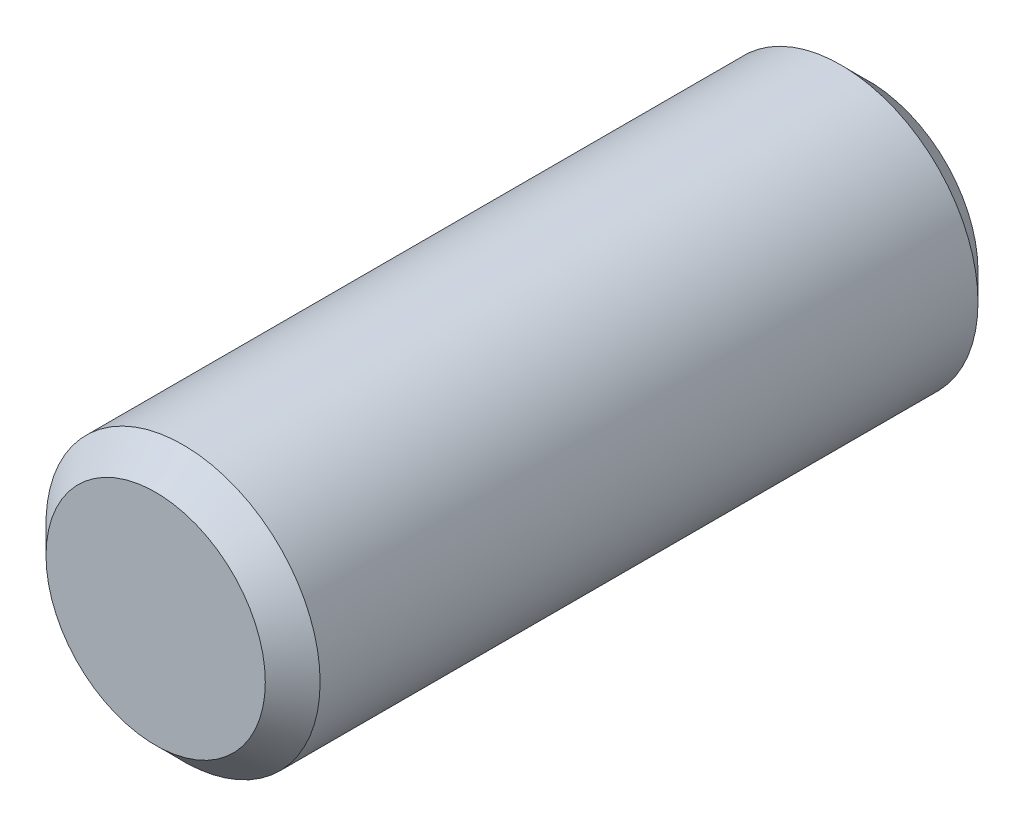
ISO-10303-21;
HEADER;
FILE_DESCRIPTION(('STEP AP214'),'2;1');
FILE_NAME('part.step','',(''),(''),'','','');
FILE_SCHEMA(('AUTOMOTIVE_DESIGN { 1 0 10303 214 1 1 1 1 }'));
ENDSEC;
DATA;
#1=APPLICATION_CONTEXT('core data for automotive mechanical design processes');
#2=APPLICATION_PROTOCOL_DEFINITION('international standard','automotive_design',2000,#1);
#3=PRODUCT_CONTEXT('',#1,'mechanical');
#4=PRODUCT('Part','Part','',(#3));
#5=PRODUCT_RELATED_PRODUCT_CATEGORY('part','',(#4));
#6=PRODUCT_DEFINITION_FORMATION('','',#4);
#7=PRODUCT_DEFINITION_CONTEXT('part definition',#1,'design');
#8=PRODUCT_DEFINITION('design','',#6,#7);
#9=PRODUCT_DEFINITION_SHAPE('','',#8);
#10=(LENGTH_UNIT() NAMED_UNIT(*) SI_UNIT(.MILLI.,.METRE.));
#11=(NAMED_UNIT(*) PLANE_ANGLE_UNIT() SI_UNIT($,.RADIAN.));
#12=(NAMED_UNIT(*) SI_UNIT($,.STERADIAN.) SOLID_ANGLE_UNIT());
#13=UNCERTAINTY_MEASURE_WITH_UNIT(LENGTH_MEASURE(1.E-05),#10,'distance_accuracy_value','');
#14=(GEOMETRIC_REPRESENTATION_CONTEXT(3) GLOBAL_UNCERTAINTY_ASSIGNED_CONTEXT((#13)) GLOBAL_UNIT_ASSIGNED_CONTEXT((#10,
#11,#12)) REPRESENTATION_CONTEXT('',''));
#15=CARTESIAN_POINT('',(0.,0.,0.));
#16=DIRECTION('',(0.,0.,1.));
#17=DIRECTION('',(1.,0.,0.));
#18=AXIS2_PLACEMENT_3D('',#15,#16,#17);
#19=CARTESIAN_POINT('',(0.,0.,-52.));
#20=DIRECTION('',(0.,0.,1.));
#21=DIRECTION('',(1.,0.,0.));
#22=AXIS2_PLACEMENT_3D('',#19,#20,#21);
#23=CYLINDRICAL_SURFACE('',#22,10.);
#24=CARTESIAN_POINT('',(0.,0.,-50.));
#25=DIRECTION('',(0.,0.,1.));
#26=DIRECTION('',(1.,0.,0.));
#27=AXIS2_PLACEMENT_3D('',#24,#25,#26);
#28=CIRCLE('',#27,10.);
#29=CARTESIAN_POINT('',(10.,0.,-50.));
#30=VERTEX_POINT('',#29);
#31=EDGE_CURVE('E42',#30,#30,#28,.T.);
#32=CARTESIAN_POINT('',(0.,0.,-1.99999999999999));
#33=DIRECTION('',(0.,0.,1.));
#34=DIRECTION('',(1.,0.,0.));
#35=AXIS2_PLACEMENT_3D('',#32,#33,#34);
#36=CIRCLE('',#35,10.);
#37=CARTESIAN_POINT('',(10.,0.,-1.99999999999999));
#38=VERTEX_POINT('',#37);
#39=EDGE_CURVE('E46',#38,#38,#36,.F.);
#40=CARTESIAN_POINT('',(10.,0.,-50.));
#41=CARTESIAN_POINT('',(10.,0.,-49.5));
#42=CARTESIAN_POINT('',(10.,0.,-49.));
#43=CARTESIAN_POINT('',(10.,0.,-48.));
#44=CARTESIAN_POINT('',(10.,0.,-47.5));
#45=CARTESIAN_POINT('',(10.,0.,-46.5));
#46=CARTESIAN_POINT('',(10.,0.,-46.));
#47=CARTESIAN_POINT('',(10.,0.,-45.));
#48=CARTESIAN_POINT('',(10.,0.,-44.5));
#49=CARTESIAN_POINT('',(10.,0.,-43.5));
#50=CARTESIAN_POINT('',(10.,0.,-43.));
#51=CARTESIAN_POINT('',(10.,0.,-42.));
#52=CARTESIAN_POINT('',(10.,0.,-41.5));
#53=CARTESIAN_POINT('',(10.,0.,-40.5));
#54=CARTESIAN_POINT('',(10.,0.,-40.));
#55=CARTESIAN_POINT('',(10.,0.,-39.));
#56=CARTESIAN_POINT('',(10.,0.,-38.5));
#57=CARTESIAN_POINT('',(10.,0.,-37.5));
#58=CARTESIAN_POINT('',(10.,0.,-37.));
#59=CARTESIAN_POINT('',(10.,0.,-36.));
#60=CARTESIAN_POINT('',(10.,0.,-35.5));
#61=CARTESIAN_POINT('',(10.,0.,-34.5));
#62=CARTESIAN_POINT('',(10.,0.,-34.));
#63=CARTESIAN_POINT('',(10.,0.,-33.));
#64=CARTESIAN_POINT('',(10.,0.,-32.5));
#65=CARTESIAN_POINT('',(10.,0.,-31.5));
#66=CARTESIAN_POINT('',(10.,0.,-31.));
#67=CARTESIAN_POINT('',(10.,0.,-30.));
#68=CARTESIAN_POINT('',(10.,0.,-29.5));
#69=CARTESIAN_POINT('',(10.,0.,-28.5));
#70=CARTESIAN_POINT('',(10.,0.,-28.));
#71=CARTESIAN_POINT('',(10.,0.,-27.));
#72=CARTESIAN_POINT('',(10.,0.,-26.5));
#73=CARTESIAN_POINT('',(10.,0.,-25.5));
#74=CARTESIAN_POINT('',(10.,0.,-25.));
#75=CARTESIAN_POINT('',(10.,0.,-24.));
#76=CARTESIAN_POINT('',(10.,0.,-23.5));
#77=CARTESIAN_POINT('',(10.,0.,-22.5));
#78=CARTESIAN_POINT('',(10.,0.,-22.));
#79=CARTESIAN_POINT('',(10.,0.,-21.));
#80=CARTESIAN_POINT('',(10.,0.,-20.5));
#81=CARTESIAN_POINT('',(10.,0.,-19.5));
#82=CARTESIAN_POINT('',(10.,0.,-19.));
#83=CARTESIAN_POINT('',(10.,0.,-18.));
#84=CARTESIAN_POINT('',(10.,0.,-17.5));
#85=CARTESIAN_POINT('',(10.,0.,-16.5));
#86=CARTESIAN_POINT('',(10.,0.,-16.));
#87=CARTESIAN_POINT('',(10.,0.,-15.));
#88=CARTESIAN_POINT('',(10.,0.,-14.5));
#89=CARTESIAN_POINT('',(10.,0.,-13.5));
#90=CARTESIAN_POINT('',(10.,0.,-13.));
#91=CARTESIAN_POINT('',(10.,0.,-12.));
#92=CARTESIAN_POINT('',(10.,0.,-11.5));
#93=CARTESIAN_POINT('',(10.,0.,-10.5));
#94=CARTESIAN_POINT('',(10.,0.,-9.99999999999999));
#95=CARTESIAN_POINT('',(10.,0.,-8.99999999999999));
#96=CARTESIAN_POINT('',(10.,0.,-8.49999999999999));
#97=CARTESIAN_POINT('',(10.,0.,-7.49999999999999));
#98=CARTESIAN_POINT('',(10.,0.,-6.99999999999999));
#99=CARTESIAN_POINT('',(10.,0.,-5.99999999999999));
#100=CARTESIAN_POINT('',(10.,0.,-5.49999999999999));
#101=CARTESIAN_POINT('',(10.,0.,-4.49999999999999));
#102=CARTESIAN_POINT('',(10.,0.,-3.99999999999999));
#103=CARTESIAN_POINT('',(10.,0.,-2.99999999999999));
#104=CARTESIAN_POINT('',(10.,0.,-2.49999999999999));
#105=CARTESIAN_POINT('',(10.,0.,-1.99999999999999));
#106=B_SPLINE_CURVE_WITH_KNOTS('',3,(#40,#41,#42,#43,#44,#45,#46,#47,#48,#49,#50,#51,#52,#53,
#54,#55,#56,#57,#58,#59,#60,#61,#62,#63,#64,#65,#66,#67,#68,#69,#70,#71,#72,#73,#74,#75,#76,#77,
#78,#79,#80,#81,#82,#83,#84,#85,#86,#87,#88,#89,#90,#91,#92,#93,#94,#95,#96,#97,#98,#99,#100,
#101,#102,#103,#104,#105),.UNSPECIFIED.,.F.,.F.,(4,2,2,2,2,2,2,2,2,2,2,2,2,2,2,2,2,2,2,2,2,2,2,
2,2,2,2,2,2,2,2,2,4),(0.,1.49999999999999,3.,4.5,5.99999999999999,7.49999999999999,
8.99999999999999,10.5,12.,13.5,15.,16.5,18.,19.5,21.,22.5,24.,25.5,27.,28.5,30.,31.5,33.,34.5,
36.,37.5,39.,40.5,42.,43.5,45.,46.5,48.),.UNSPECIFIED.);
#107=EDGE_CURVE('BSEAM31',#30,#38,#106,.T.);
#108=ORIENTED_EDGE('',*,*,#31,.T.);
#109=ORIENTED_EDGE('',*,*,#39,.T.);
#110=ORIENTED_EDGE('',*,*,#107,.T.);
#111=ORIENTED_EDGE('',*,*,#107,.F.);
#112=EDGE_LOOP('',(#108,#110,#109,#111));
#113=FACE_BOUND('',#112,.T.);
#114=ADVANCED_FACE('F31',(#113),#23,.T.);
#115=CARTESIAN_POINT('',(0.,0.,-52.));
#116=DIRECTION('',(0.,0.,1.));
#117=DIRECTION('',(1.,0.,0.));
#118=AXIS2_PLACEMENT_3D('',#115,#116,#117);
#119=PLANE('',#118);
#120=CARTESIAN_POINT('',(0.,0.,-52.));
#121=DIRECTION('',(0.,0.,1.));
#122=DIRECTION('',(1.,0.,0.));
#123=AXIS2_PLACEMENT_3D('',#120,#121,#122);
#124=CIRCLE('',#123,7.99999999999996);
#125=CARTESIAN_POINT('',(7.99999999999996,0.,-52.));
#126=VERTEX_POINT('',#125);
#127=EDGE_CURVE('E38',#126,#126,#124,.F.);
#128=ORIENTED_EDGE('',*,*,#127,.T.);
#129=EDGE_LOOP('',(#128));
#130=FACE_BOUND('',#129,.T.);
#131=ADVANCED_FACE('F62',(#130),#119,.F.);
#132=CARTESIAN_POINT('',(0.,0.,0.));
#133=DIRECTION('',(0.,0.,1.));
#134=DIRECTION('',(1.,0.,0.));
#135=AXIS2_PLACEMENT_3D('',#132,#133,#134);
#136=PLANE('',#135);
#137=CARTESIAN_POINT('',(0.,0.,0.));
#138=DIRECTION('',(0.,0.,1.));
#139=DIRECTION('',(1.,0.,0.));
#140=AXIS2_PLACEMENT_3D('',#137,#138,#139);
#141=CIRCLE('',#140,8.00000000000001);
#142=CARTESIAN_POINT('',(8.00000000000001,0.,0.));
#143=VERTEX_POINT('',#142);
#144=EDGE_CURVE('E10',#143,#143,#141,.T.);
#145=ORIENTED_EDGE('',*,*,#144,.T.);
#146=EDGE_LOOP('',(#145));
#147=FACE_BOUND('',#146,.T.);
#148=ADVANCED_FACE('F59',(#147),#136,.T.);
#149=CARTESIAN_POINT('',(0.,0.,-50.));
#150=DIRECTION('',(0.,0.,1.));
#151=DIRECTION('',(1.,0.,0.));
#152=AXIS2_PLACEMENT_3D('',#149,#150,#151);
#153=CONICAL_SURFACE('',#152,10.,0.78539816339745);
#154=ORIENTED_EDGE('',*,*,#127,.F.);
#155=EDGE_LOOP('',(#154));
#156=FACE_BOUND('',#155,.T.);
#157=ORIENTED_EDGE('',*,*,#31,.F.);
#158=EDGE_LOOP('',(#157));
#159=FACE_BOUND('',#158,.T.);
#160=ADVANCED_FACE('F55',(#156,#159),#153,.T.);
#161=CARTESIAN_POINT('',(0.,0.,0.));
#162=DIRECTION('',(0.,0.,-1.));
#163=DIRECTION('',(-1.,0.,0.));
#164=AXIS2_PLACEMENT_3D('',#161,#162,#163);
#165=CONICAL_SURFACE('',#164,8.00000000000001,0.785398163397449);
#166=ORIENTED_EDGE('',*,*,#39,.F.);
#167=EDGE_LOOP('',(#166));
#168=FACE_BOUND('',#167,.T.);
#169=ORIENTED_EDGE('',*,*,#144,.F.);
#170=EDGE_LOOP('',(#169));
#171=FACE_BOUND('',#170,.T.);
#172=ADVANCED_FACE('F33',(#168,#171),#165,.T.);
#173=CLOSED_SHELL('',(#114,#131,#148,#160,#172));
#174=MANIFOLD_SOLID_BREP('B2',#173);
#175=ADVANCED_BREP_SHAPE_REPRESENTATION('',(#18,#174),#14);
#176=SHAPE_DEFINITION_REPRESENTATION(#9,#175);
ENDSEC;
END-ISO-10303-21;
